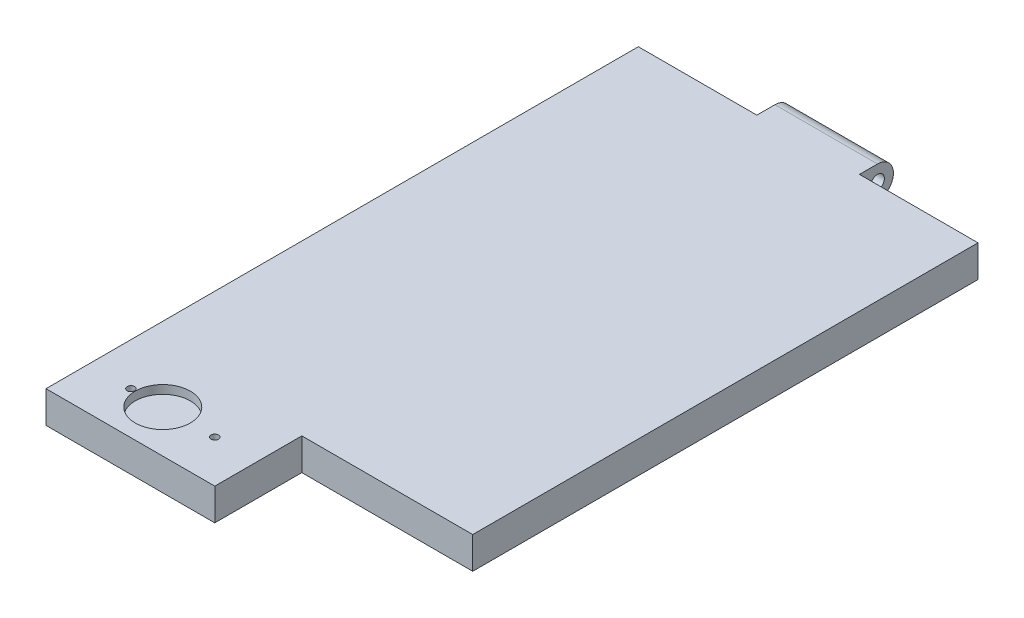
ISO-10303-21;
HEADER;
FILE_DESCRIPTION(('STEP AP214'),'2;1');
FILE_NAME('part.step','',(''),(''),'','','');
FILE_SCHEMA(('AUTOMOTIVE_DESIGN { 1 0 10303 214 1 1 1 1 }'));
ENDSEC;
DATA;
#1=APPLICATION_CONTEXT('core data for automotive mechanical design processes');
#2=APPLICATION_PROTOCOL_DEFINITION('international standard','automotive_design',2000,#1);
#3=PRODUCT_CONTEXT('',#1,'mechanical');
#4=PRODUCT('Part','Part','',(#3));
#5=PRODUCT_RELATED_PRODUCT_CATEGORY('part','',(#4));
#6=PRODUCT_DEFINITION_FORMATION('','',#4);
#7=PRODUCT_DEFINITION_CONTEXT('part definition',#1,'design');
#8=PRODUCT_DEFINITION('design','',#6,#7);
#9=PRODUCT_DEFINITION_SHAPE('','',#8);
#10=(LENGTH_UNIT() NAMED_UNIT(*) SI_UNIT(.MILLI.,.METRE.));
#11=(NAMED_UNIT(*) PLANE_ANGLE_UNIT() SI_UNIT($,.RADIAN.));
#12=(NAMED_UNIT(*) SI_UNIT($,.STERADIAN.) SOLID_ANGLE_UNIT());
#13=UNCERTAINTY_MEASURE_WITH_UNIT(LENGTH_MEASURE(1.E-05),#10,'distance_accuracy_value','');
#14=(GEOMETRIC_REPRESENTATION_CONTEXT(3) GLOBAL_UNCERTAINTY_ASSIGNED_CONTEXT((#13)) GLOBAL_UNIT_ASSIGNED_CONTEXT((#10,
#11,#12)) REPRESENTATION_CONTEXT('',''));
#15=CARTESIAN_POINT('',(0.,0.,0.));
#16=DIRECTION('',(0.,0.,1.));
#17=DIRECTION('',(1.,0.,0.));
#18=AXIS2_PLACEMENT_3D('',#15,#16,#17);
#19=CARTESIAN_POINT('',(0.,3.,56.0000000000242));
#20=DIRECTION('',(-1.,0.,0.));
#21=DIRECTION('',(0.,0.,1.));
#22=AXIS2_PLACEMENT_3D('',#19,#20,#21);
#23=PLANE('',#22);
#24=DIRECTION('',(0.,0.,-1.));
#25=VECTOR('',#24,1.);
#26=CARTESIAN_POINT('',(0.,3.,56.0000000000242));
#27=LINE('',#26,#25);
#28=CARTESIAN_POINT('',(0.,3.,56.0000000000242));
#29=VERTEX_POINT('',#28);
#30=CARTESIAN_POINT('',(0.,3.,0.2));
#31=VERTEX_POINT('',#30);
#32=EDGE_CURVE('E215',#29,#31,#27,.T.);
#33=ORIENTED_EDGE('',*,*,#32,.T.);
#34=DIRECTION('',(0.,1.,0.));
#35=VECTOR('',#34,1.);
#36=CARTESIAN_POINT('',(0.,0.,0.2));
#37=LINE('',#36,#35);
#38=CARTESIAN_POINT('',(0.,0.,0.2));
#39=VERTEX_POINT('',#38);
#40=EDGE_CURVE('E166',#39,#31,#37,.T.);
#41=ORIENTED_EDGE('',*,*,#40,.F.);
#42=DIRECTION('',(0.,0.,-1.));
#43=VECTOR('',#42,1.);
#44=CARTESIAN_POINT('',(0.,0.,56.0000000000242));
#45=LINE('',#44,#43);
#46=CARTESIAN_POINT('',(0.,0.,56.0000000000242));
#47=VERTEX_POINT('',#46);
#48=EDGE_CURVE('E214',#47,#39,#45,.T.);
#49=ORIENTED_EDGE('',*,*,#48,.F.);
#50=DIRECTION('',(0.,-1.,0.));
#51=VECTOR('',#50,1.);
#52=CARTESIAN_POINT('',(0.,3.,56.0000000000242));
#53=LINE('',#52,#51);
#54=EDGE_CURVE('E224',#29,#47,#53,.T.);
#55=ORIENTED_EDGE('',*,*,#54,.F.);
#56=EDGE_LOOP('',(#33,#41,#49,#55));
#57=FACE_BOUND('',#56,.T.);
#58=ADVANCED_FACE('F65',(#57),#23,.T.);
#59=CARTESIAN_POINT('',(32.,3.,56.0000000000242));
#60=DIRECTION('',(-1.,0.,0.));
#61=DIRECTION('',(0.,0.,1.));
#62=AXIS2_PLACEMENT_3D('',#59,#60,#61);
#63=PLANE('',#62);
#64=DIRECTION('',(0.,-1.,0.));
#65=VECTOR('',#64,1.);
#66=CARTESIAN_POINT('',(32.,0.,0.2));
#67=LINE('',#66,#65);
#68=CARTESIAN_POINT('',(32.,3.,0.2));
#69=VERTEX_POINT('',#68);
#70=CARTESIAN_POINT('',(32.,0.,0.2));
#71=VERTEX_POINT('',#70);
#72=EDGE_CURVE('E170',#69,#71,#67,.T.);
#73=ORIENTED_EDGE('',*,*,#72,.F.);
#74=DIRECTION('',(0.,0.,-1.));
#75=VECTOR('',#74,1.);
#76=CARTESIAN_POINT('',(32.,3.,56.0000000000242));
#77=LINE('',#76,#75);
#78=CARTESIAN_POINT('',(32.,3.,47.8000000000242));
#79=VERTEX_POINT('',#78);
#80=EDGE_CURVE('E217',#79,#69,#77,.T.);
#81=ORIENTED_EDGE('',*,*,#80,.F.);
#82=DIRECTION('',(0.,-1.,0.));
#83=VECTOR('',#82,1.);
#84=CARTESIAN_POINT('',(32.,3.,47.8000000000242));
#85=LINE('',#84,#83);
#86=CARTESIAN_POINT('',(32.,0.,47.8000000000242));
#87=VERTEX_POINT('',#86);
#88=EDGE_CURVE('E204',#79,#87,#85,.T.);
#89=ORIENTED_EDGE('',*,*,#88,.T.);
#90=DIRECTION('',(0.,0.,-1.));
#91=VECTOR('',#90,1.);
#92=CARTESIAN_POINT('',(32.,0.,56.0000000000242));
#93=LINE('',#92,#91);
#94=EDGE_CURVE('E227',#87,#71,#93,.T.);
#95=ORIENTED_EDGE('',*,*,#94,.T.);
#96=EDGE_LOOP('',(#73,#81,#89,#95));
#97=FACE_BOUND('',#96,.T.);
#98=ADVANCED_FACE('F261',(#97),#63,.F.);
#99=CARTESIAN_POINT('',(0.,3.,0.));
#100=DIRECTION('',(0.,-1.,0.));
#101=DIRECTION('',(0.,0.,-1.));
#102=AXIS2_PLACEMENT_3D('',#99,#100,#101);
#103=PLANE('',#102);
#104=CARTESIAN_POINT('',(11.9,3.,52.0000000000242));
#105=DIRECTION('',(0.,-1.,0.));
#106=DIRECTION('',(0.,0.,-1.));
#107=AXIS2_PLACEMENT_3D('',#104,#105,#106);
#108=CIRCLE('',#107,0.35);
#109=CARTESIAN_POINT('',(11.9,3.,51.6500000000242));
#110=VERTEX_POINT('',#109);
#111=EDGE_CURVE('E507',#110,#110,#108,.T.);
#112=ORIENTED_EDGE('',*,*,#111,.T.);
#113=EDGE_LOOP('',(#112));
#114=FACE_BOUND('',#113,.T.);
#115=CARTESIAN_POINT('',(4.,3.,52.0000000000242));
#116=DIRECTION('',(0.,-1.,0.));
#117=DIRECTION('',(0.,0.,-1.));
#118=AXIS2_PLACEMENT_3D('',#115,#116,#117);
#119=CIRCLE('',#118,0.350000000000002);
#120=CARTESIAN_POINT('',(4.,3.,51.6500000000242));
#121=VERTEX_POINT('',#120);
#122=EDGE_CURVE('E515',#121,#121,#119,.T.);
#123=ORIENTED_EDGE('',*,*,#122,.T.);
#124=EDGE_LOOP('',(#123));
#125=FACE_BOUND('',#124,.T.);
#126=CARTESIAN_POINT('',(7.00000000000002,3.,51.9999999999974));
#127=DIRECTION('',(0.,1.,0.));
#128=DIRECTION('',(0.,0.,1.));
#129=AXIS2_PLACEMENT_3D('',#126,#127,#128);
#130=CIRCLE('',#129,2.60000000000001);
#131=CARTESIAN_POINT('',(7.00000000000002,3.,54.5999999999974));
#132=VERTEX_POINT('',#131);
#133=EDGE_CURVE('E173',#132,#132,#130,.T.);
#134=ORIENTED_EDGE('',*,*,#133,.F.);
#135=EDGE_LOOP('',(#134));
#136=FACE_BOUND('',#135,.T.);
#137=DIRECTION('',(0.,0.,1.));
#138=VECTOR('',#137,1.);
#139=CARTESIAN_POINT('',(11.1666666666667,3.,-3.));
#140=LINE('',#139,#138);
#141=CARTESIAN_POINT('',(11.1666666666667,3.,-1.5));
#142=VERTEX_POINT('',#141);
#143=CARTESIAN_POINT('',(11.1666666666667,3.,0.2));
#144=VERTEX_POINT('',#143);
#145=EDGE_CURVE('E145',#142,#144,#140,.T.);
#146=ORIENTED_EDGE('',*,*,#145,.T.);
#147=DIRECTION('',(1.,0.,0.));
#148=VECTOR('',#147,1.);
#149=CARTESIAN_POINT('',(0.,3.,0.2));
#150=LINE('',#149,#148);
#151=EDGE_CURVE('E150',#31,#144,#150,.T.);
#152=ORIENTED_EDGE('',*,*,#151,.F.);
#153=ORIENTED_EDGE('',*,*,#32,.F.);
#154=DIRECTION('',(1.,0.,0.));
#155=VECTOR('',#154,1.);
#156=CARTESIAN_POINT('',(0.,3.,56.0000000000242));
#157=LINE('',#156,#155);
#158=CARTESIAN_POINT('',(15.9,3.,56.0000000000242));
#159=VERTEX_POINT('',#158);
#160=EDGE_CURVE('E221',#29,#159,#157,.T.);
#161=ORIENTED_EDGE('',*,*,#160,.T.);
#162=DIRECTION('',(0.,0.,-1.));
#163=VECTOR('',#162,1.);
#164=CARTESIAN_POINT('',(15.9,3.,0.));
#165=LINE('',#164,#163);
#166=CARTESIAN_POINT('',(15.9,3.,47.8000000000242));
#167=VERTEX_POINT('',#166);
#168=EDGE_CURVE('E200',#159,#167,#165,.T.);
#169=ORIENTED_EDGE('',*,*,#168,.T.);
#170=DIRECTION('',(1.,0.,0.));
#171=VECTOR('',#170,1.);
#172=CARTESIAN_POINT('',(0.,3.,47.8000000000242));
#173=LINE('',#172,#171);
#174=EDGE_CURVE('E197',#167,#79,#173,.T.);
#175=ORIENTED_EDGE('',*,*,#174,.T.);
#176=ORIENTED_EDGE('',*,*,#80,.T.);
#177=DIRECTION('',(1.,0.,0.));
#178=VECTOR('',#177,1.);
#179=CARTESIAN_POINT('',(0.,3.,0.2));
#180=LINE('',#179,#178);
#181=CARTESIAN_POINT('',(20.8333333333334,3.,0.2));
#182=VERTEX_POINT('',#181);
#183=EDGE_CURVE('E182',#182,#69,#180,.T.);
#184=ORIENTED_EDGE('',*,*,#183,.F.);
#185=DIRECTION('',(0.,0.,1.));
#186=VECTOR('',#185,1.);
#187=CARTESIAN_POINT('',(20.8333333333334,3.,-3.));
#188=LINE('',#187,#186);
#189=CARTESIAN_POINT('',(20.8333333333334,3.,-1.5));
#190=VERTEX_POINT('',#189);
#191=EDGE_CURVE('E194',#190,#182,#188,.T.);
#192=ORIENTED_EDGE('',*,*,#191,.F.);
#193=DIRECTION('',(1.,0.,0.));
#194=VECTOR('',#193,1.);
#195=CARTESIAN_POINT('',(11.1666666666667,3.,-1.5));
#196=LINE('',#195,#194);
#197=EDGE_CURVE('E154',#190,#142,#196,.F.);
#198=ORIENTED_EDGE('',*,*,#197,.T.);
#199=EDGE_LOOP('',(#146,#152,#153,#161,#169,#175,#176,#184,#192,#198));
#200=FACE_BOUND('',#199,.T.);
#201=ADVANCED_FACE('F147',(#114,#125,#136,#200),#103,.F.);
#202=CARTESIAN_POINT('',(0.,0.,0.));
#203=DIRECTION('',(0.,-1.,0.));
#204=DIRECTION('',(0.,0.,-1.));
#205=AXIS2_PLACEMENT_3D('',#202,#203,#204);
#206=PLANE('',#205);
#207=CARTESIAN_POINT('',(11.9,0.,52.0000000000242));
#208=DIRECTION('',(0.,-1.,0.));
#209=DIRECTION('',(0.,0.,-1.));
#210=AXIS2_PLACEMENT_3D('',#207,#208,#209);
#211=CIRCLE('',#210,0.35);
#212=CARTESIAN_POINT('',(11.9,0.,51.6500000000242));
#213=VERTEX_POINT('',#212);
#214=EDGE_CURVE('E510',#213,#213,#211,.T.);
#215=ORIENTED_EDGE('',*,*,#214,.F.);
#216=EDGE_LOOP('',(#215));
#217=FACE_BOUND('',#216,.T.);
#218=CARTESIAN_POINT('',(4.,0.,52.0000000000242));
#219=DIRECTION('',(0.,-1.,0.));
#220=DIRECTION('',(0.,0.,-1.));
#221=AXIS2_PLACEMENT_3D('',#218,#219,#220);
#222=CIRCLE('',#221,0.350000000000002);
#223=CARTESIAN_POINT('',(4.,0.,51.6500000000242));
#224=VERTEX_POINT('',#223);
#225=EDGE_CURVE('E511',#224,#224,#222,.T.);
#226=ORIENTED_EDGE('',*,*,#225,.F.);
#227=EDGE_LOOP('',(#226));
#228=FACE_BOUND('',#227,.T.);
#229=DIRECTION('',(-1.,0.,0.));
#230=VECTOR('',#229,1.);
#231=CARTESIAN_POINT('',(0.,0.,0.2));
#232=LINE('',#231,#230);
#233=CARTESIAN_POINT('',(11.1666666666667,0.,0.2));
#234=VERTEX_POINT('',#233);
#235=EDGE_CURVE('E162',#234,#39,#232,.T.);
#236=ORIENTED_EDGE('',*,*,#235,.F.);
#237=DIRECTION('',(0.,0.,1.));
#238=VECTOR('',#237,1.);
#239=CARTESIAN_POINT('',(11.1666666666667,0.,-3.));
#240=LINE('',#239,#238);
#241=CARTESIAN_POINT('',(11.1666666666667,0.,-1.5));
#242=VERTEX_POINT('',#241);
#243=EDGE_CURVE('E155',#242,#234,#240,.T.);
#244=ORIENTED_EDGE('',*,*,#243,.F.);
#245=DIRECTION('',(-1.,0.,0.));
#246=VECTOR('',#245,1.);
#247=CARTESIAN_POINT('',(0.,0.,-1.5));
#248=LINE('',#247,#246);
#249=CARTESIAN_POINT('',(20.8333333333334,0.,-1.5));
#250=VERTEX_POINT('',#249);
#251=EDGE_CURVE('E12',#242,#250,#248,.F.);
#252=ORIENTED_EDGE('',*,*,#251,.T.);
#253=DIRECTION('',(0.,0.,1.));
#254=VECTOR('',#253,1.);
#255=CARTESIAN_POINT('',(20.8333333333334,0.,-3.));
#256=LINE('',#255,#254);
#257=CARTESIAN_POINT('',(20.8333333333334,0.,0.2));
#258=VERTEX_POINT('',#257);
#259=EDGE_CURVE('E192',#250,#258,#256,.T.);
#260=ORIENTED_EDGE('',*,*,#259,.T.);
#261=DIRECTION('',(-1.,0.,0.));
#262=VECTOR('',#261,1.);
#263=CARTESIAN_POINT('',(0.,0.,0.2));
#264=LINE('',#263,#262);
#265=EDGE_CURVE('E167',#71,#258,#264,.T.);
#266=ORIENTED_EDGE('',*,*,#265,.F.);
#267=ORIENTED_EDGE('',*,*,#94,.F.);
#268=DIRECTION('',(1.,0.,0.));
#269=VECTOR('',#268,1.);
#270=CARTESIAN_POINT('',(0.,0.,47.8000000000242));
#271=LINE('',#270,#269);
#272=CARTESIAN_POINT('',(15.9,0.,47.8000000000242));
#273=VERTEX_POINT('',#272);
#274=EDGE_CURVE('E196',#273,#87,#271,.T.);
#275=ORIENTED_EDGE('',*,*,#274,.F.);
#276=DIRECTION('',(0.,0.,-1.));
#277=VECTOR('',#276,1.);
#278=CARTESIAN_POINT('',(15.9,0.,0.));
#279=LINE('',#278,#277);
#280=CARTESIAN_POINT('',(15.9,0.,56.0000000000242));
#281=VERTEX_POINT('',#280);
#282=EDGE_CURVE('E201',#281,#273,#279,.T.);
#283=ORIENTED_EDGE('',*,*,#282,.F.);
#284=DIRECTION('',(1.,0.,0.));
#285=VECTOR('',#284,1.);
#286=CARTESIAN_POINT('',(0.,0.,56.0000000000242));
#287=LINE('',#286,#285);
#288=EDGE_CURVE('E218',#47,#281,#287,.T.);
#289=ORIENTED_EDGE('',*,*,#288,.F.);
#290=ORIENTED_EDGE('',*,*,#48,.T.);
#291=EDGE_LOOP('',(#236,#244,#252,#260,#266,#267,#275,#283,#289,#290));
#292=FACE_BOUND('',#291,.T.);
#293=ADVANCED_FACE('F253',(#217,#228,#292),#206,.T.);
#294=CARTESIAN_POINT('',(0.,3.,56.0000000000242));
#295=DIRECTION('',(0.,0.,-1.));
#296=DIRECTION('',(-1.,0.,0.));
#297=AXIS2_PLACEMENT_3D('',#294,#295,#296);
#298=PLANE('',#297);
#299=ORIENTED_EDGE('',*,*,#288,.T.);
#300=DIRECTION('',(0.,-1.,0.));
#301=VECTOR('',#300,1.);
#302=CARTESIAN_POINT('',(15.9,3.,56.0000000000242));
#303=LINE('',#302,#301);
#304=EDGE_CURVE('E210',#159,#281,#303,.T.);
#305=ORIENTED_EDGE('',*,*,#304,.F.);
#306=ORIENTED_EDGE('',*,*,#160,.F.);
#307=ORIENTED_EDGE('',*,*,#54,.T.);
#308=EDGE_LOOP('',(#299,#305,#306,#307));
#309=FACE_BOUND('',#308,.T.);
#310=ADVANCED_FACE('F272',(#309),#298,.F.);
#311=CARTESIAN_POINT('',(0.,3.,47.8000000000242));
#312=DIRECTION('',(0.,0.,-1.));
#313=DIRECTION('',(-1.,0.,0.));
#314=AXIS2_PLACEMENT_3D('',#311,#312,#313);
#315=PLANE('',#314);
#316=ORIENTED_EDGE('',*,*,#274,.T.);
#317=ORIENTED_EDGE('',*,*,#88,.F.);
#318=ORIENTED_EDGE('',*,*,#174,.F.);
#319=DIRECTION('',(0.,-1.,0.));
#320=VECTOR('',#319,1.);
#321=CARTESIAN_POINT('',(15.9,3.,47.8000000000242));
#322=LINE('',#321,#320);
#323=EDGE_CURVE('E212',#167,#273,#322,.T.);
#324=ORIENTED_EDGE('',*,*,#323,.T.);
#325=EDGE_LOOP('',(#316,#317,#318,#324));
#326=FACE_BOUND('',#325,.T.);
#327=ADVANCED_FACE('F265',(#326),#315,.F.);
#328=CARTESIAN_POINT('',(15.9,3.,0.));
#329=DIRECTION('',(-1.,0.,0.));
#330=DIRECTION('',(0.,0.,1.));
#331=AXIS2_PLACEMENT_3D('',#328,#329,#330);
#332=PLANE('',#331);
#333=ORIENTED_EDGE('',*,*,#282,.T.);
#334=ORIENTED_EDGE('',*,*,#323,.F.);
#335=ORIENTED_EDGE('',*,*,#168,.F.);
#336=ORIENTED_EDGE('',*,*,#304,.T.);
#337=EDGE_LOOP('',(#333,#334,#335,#336));
#338=FACE_BOUND('',#337,.T.);
#339=ADVANCED_FACE('F269',(#338),#332,.F.);
#340=CARTESIAN_POINT('',(20.8333333333334,0.,-3.));
#341=DIRECTION('',(-1.,0.,0.));
#342=DIRECTION('',(0.,0.,1.));
#343=AXIS2_PLACEMENT_3D('',#340,#341,#342);
#344=PLANE('',#343);
#345=CARTESIAN_POINT('',(20.8333333333334,1.5,-1.5));
#346=DIRECTION('',(-1.,0.,0.));
#347=DIRECTION('',(0.,0.,1.));
#348=AXIS2_PLACEMENT_3D('',#345,#346,#347);
#349=CIRCLE('',#348,0.65);
#350=CARTESIAN_POINT('',(20.8333333333334,1.5,-0.85));
#351=VERTEX_POINT('',#350);
#352=EDGE_CURVE('E188',#351,#351,#349,.T.);
#353=ORIENTED_EDGE('',*,*,#352,.T.);
#354=EDGE_LOOP('',(#353));
#355=FACE_BOUND('',#354,.T.);
#356=CARTESIAN_POINT('',(20.8333333333334,1.5,-1.5));
#357=DIRECTION('',(-1.,0.,0.));
#358=DIRECTION('',(0.,0.,1.));
#359=AXIS2_PLACEMENT_3D('',#356,#357,#358);
#360=CIRCLE('',#359,1.5);
#361=CARTESIAN_POINT('',(20.8333333333334,1.5,-3.));
#362=VERTEX_POINT('',#361);
#363=EDGE_CURVE('E233',#250,#362,#360,.F.);
#364=ORIENTED_EDGE('',*,*,#363,.T.);
#365=CARTESIAN_POINT('',(20.8333333333334,1.5,-1.5));
#366=DIRECTION('',(-1.,0.,0.));
#367=DIRECTION('',(0.,0.,1.));
#368=AXIS2_PLACEMENT_3D('',#365,#366,#367);
#369=CIRCLE('',#368,1.5);
#370=EDGE_CURVE('E235',#362,#190,#369,.F.);
#371=ORIENTED_EDGE('',*,*,#370,.T.);
#372=ORIENTED_EDGE('',*,*,#191,.T.);
#373=DIRECTION('',(0.,-1.,0.));
#374=VECTOR('',#373,1.);
#375=CARTESIAN_POINT('',(20.8333333333334,0.,0.2));
#376=LINE('',#375,#374);
#377=EDGE_CURVE('E179',#182,#258,#376,.T.);
#378=ORIENTED_EDGE('',*,*,#377,.T.);
#379=ORIENTED_EDGE('',*,*,#259,.F.);
#380=EDGE_LOOP('',(#364,#371,#372,#378,#379));
#381=FACE_BOUND('',#380,.T.);
#382=ADVANCED_FACE('F241',(#355,#381),#344,.F.);
#383=CARTESIAN_POINT('',(11.1666666666667,0.,-3.));
#384=DIRECTION('',(-1.,0.,0.));
#385=DIRECTION('',(0.,0.,1.));
#386=AXIS2_PLACEMENT_3D('',#383,#384,#385);
#387=PLANE('',#386);
#388=CARTESIAN_POINT('',(11.1666666666667,1.5,-1.5));
#389=DIRECTION('',(-1.,0.,0.));
#390=DIRECTION('',(0.,0.,1.));
#391=AXIS2_PLACEMENT_3D('',#388,#389,#390);
#392=CIRCLE('',#391,0.65);
#393=CARTESIAN_POINT('',(11.1666666666667,1.5,-0.85));
#394=VERTEX_POINT('',#393);
#395=EDGE_CURVE('E178',#394,#394,#392,.T.);
#396=ORIENTED_EDGE('',*,*,#395,.F.);
#397=EDGE_LOOP('',(#396));
#398=FACE_BOUND('',#397,.T.);
#399=ORIENTED_EDGE('',*,*,#145,.F.);
#400=CARTESIAN_POINT('',(11.1666666666667,1.5,-1.5));
#401=DIRECTION('',(-1.,0.,0.));
#402=DIRECTION('',(0.,0.,1.));
#403=AXIS2_PLACEMENT_3D('',#400,#401,#402);
#404=CIRCLE('',#403,1.5);
#405=CARTESIAN_POINT('',(11.1666666666667,1.5,-3.));
#406=VERTEX_POINT('',#405);
#407=EDGE_CURVE('E74',#142,#406,#404,.T.);
#408=ORIENTED_EDGE('',*,*,#407,.T.);
#409=CARTESIAN_POINT('',(11.1666666666667,1.5,-1.5));
#410=DIRECTION('',(-1.,0.,0.));
#411=DIRECTION('',(0.,0.,1.));
#412=AXIS2_PLACEMENT_3D('',#409,#410,#411);
#413=CIRCLE('',#412,1.5);
#414=EDGE_CURVE('E81',#406,#242,#413,.T.);
#415=ORIENTED_EDGE('',*,*,#414,.T.);
#416=ORIENTED_EDGE('',*,*,#243,.T.);
#417=DIRECTION('',(0.,-1.,0.));
#418=VECTOR('',#417,1.);
#419=CARTESIAN_POINT('',(11.1666666666667,0.,0.2));
#420=LINE('',#419,#418);
#421=EDGE_CURVE('E158',#144,#234,#420,.T.);
#422=ORIENTED_EDGE('',*,*,#421,.F.);
#423=EDGE_LOOP('',(#399,#408,#415,#416,#422));
#424=FACE_BOUND('',#423,.T.);
#425=ADVANCED_FACE('F159',(#398,#424),#387,.T.);
#426=CARTESIAN_POINT('',(0.,1.5,-1.5));
#427=DIRECTION('',(-1.,0.,0.));
#428=DIRECTION('',(0.,0.,1.));
#429=AXIS2_PLACEMENT_3D('',#426,#427,#428);
#430=CYLINDRICAL_SURFACE('',#429,1.5);
#431=ORIENTED_EDGE('',*,*,#251,.F.);
#432=ORIENTED_EDGE('',*,*,#414,.F.);
#433=DIRECTION('',(-1.,0.,0.));
#434=VECTOR('',#433,1.);
#435=CARTESIAN_POINT('',(0.,1.5,-3.));
#436=LINE('',#435,#434);
#437=EDGE_CURVE('E69',#362,#406,#436,.T.);
#438=ORIENTED_EDGE('',*,*,#437,.F.);
#439=ORIENTED_EDGE('',*,*,#363,.F.);
#440=EDGE_LOOP('',(#431,#432,#438,#439));
#441=FACE_BOUND('',#440,.T.);
#442=ADVANCED_FACE('F67',(#441),#430,.T.);
#443=CARTESIAN_POINT('',(0.,1.5,-1.5));
#444=DIRECTION('',(-1.,0.,0.));
#445=DIRECTION('',(0.,0.,1.));
#446=AXIS2_PLACEMENT_3D('',#443,#444,#445);
#447=CYLINDRICAL_SURFACE('',#446,1.5);
#448=ORIENTED_EDGE('',*,*,#407,.F.);
#449=ORIENTED_EDGE('',*,*,#197,.F.);
#450=ORIENTED_EDGE('',*,*,#370,.F.);
#451=ORIENTED_EDGE('',*,*,#437,.T.);
#452=EDGE_LOOP('',(#448,#449,#450,#451));
#453=FACE_BOUND('',#452,.T.);
#454=ADVANCED_FACE('F249',(#453),#447,.T.);
#455=CARTESIAN_POINT('',(32.,1.5,-1.5));
#456=DIRECTION('',(-1.,0.,0.));
#457=DIRECTION('',(0.,0.,1.));
#458=AXIS2_PLACEMENT_3D('',#455,#456,#457);
#459=CYLINDRICAL_SURFACE('',#458,0.65);
#460=ORIENTED_EDGE('',*,*,#395,.T.);
#461=EDGE_LOOP('',(#460));
#462=FACE_BOUND('',#461,.T.);
#463=ORIENTED_EDGE('',*,*,#352,.F.);
#464=EDGE_LOOP('',(#463));
#465=FACE_BOUND('',#464,.T.);
#466=ADVANCED_FACE('F284',(#462,#465),#459,.F.);
#467=CARTESIAN_POINT('',(0.,0.,0.2));
#468=DIRECTION('',(0.,0.,-1.));
#469=DIRECTION('',(-1.,0.,0.));
#470=AXIS2_PLACEMENT_3D('',#467,#468,#469);
#471=PLANE('',#470);
#472=ORIENTED_EDGE('',*,*,#151,.T.);
#473=ORIENTED_EDGE('',*,*,#421,.T.);
#474=ORIENTED_EDGE('',*,*,#235,.T.);
#475=ORIENTED_EDGE('',*,*,#40,.T.);
#476=EDGE_LOOP('',(#472,#473,#474,#475));
#477=FACE_BOUND('',#476,.T.);
#478=ADVANCED_FACE('F164',(#477),#471,.T.);
#479=CARTESIAN_POINT('',(0.,0.,0.2));
#480=DIRECTION('',(0.,0.,-1.));
#481=DIRECTION('',(-1.,0.,0.));
#482=AXIS2_PLACEMENT_3D('',#479,#480,#481);
#483=PLANE('',#482);
#484=ORIENTED_EDGE('',*,*,#377,.F.);
#485=ORIENTED_EDGE('',*,*,#183,.T.);
#486=ORIENTED_EDGE('',*,*,#72,.T.);
#487=ORIENTED_EDGE('',*,*,#265,.T.);
#488=EDGE_LOOP('',(#484,#485,#486,#487));
#489=FACE_BOUND('',#488,.T.);
#490=ADVANCED_FACE('F256',(#489),#483,.T.);
#491=CARTESIAN_POINT('',(7.00000000000002,2.2,51.9999999999974));
#492=DIRECTION('',(0.,1.,0.));
#493=DIRECTION('',(0.,0.,1.));
#494=AXIS2_PLACEMENT_3D('',#491,#492,#493);
#495=CYLINDRICAL_SURFACE('',#494,2.60000000000001);
#496=CARTESIAN_POINT('',(7.00000000000002,2.2,51.9999999999974));
#497=DIRECTION('',(0.,1.,0.));
#498=DIRECTION('',(0.,0.,1.));
#499=AXIS2_PLACEMENT_3D('',#496,#497,#498);
#500=CIRCLE('',#499,2.60000000000001);
#501=CARTESIAN_POINT('',(7.00000000000002,2.2,54.5999999999974));
#502=VERTEX_POINT('',#501);
#503=EDGE_CURVE('E183',#502,#502,#500,.T.);
#504=ORIENTED_EDGE('',*,*,#503,.F.);
#505=EDGE_LOOP('',(#504));
#506=FACE_BOUND('',#505,.T.);
#507=ORIENTED_EDGE('',*,*,#133,.T.);
#508=EDGE_LOOP('',(#507));
#509=FACE_BOUND('',#508,.T.);
#510=ADVANCED_FACE('F359',(#506,#509),#495,.F.);
#511=CARTESIAN_POINT('',(7.00000000000002,2.2,51.9999999999974));
#512=DIRECTION('',(0.,1.,0.));
#513=DIRECTION('',(0.,0.,1.));
#514=AXIS2_PLACEMENT_3D('',#511,#512,#513);
#515=PLANE('',#514);
#516=ORIENTED_EDGE('',*,*,#503,.T.);
#517=EDGE_LOOP('',(#516));
#518=FACE_BOUND('',#517,.T.);
#519=ADVANCED_FACE('F367',(#518),#515,.T.);
#520=CARTESIAN_POINT('',(4.,3.,52.0000000000242));
#521=DIRECTION('',(0.,-1.,0.));
#522=DIRECTION('',(0.,0.,-1.));
#523=AXIS2_PLACEMENT_3D('',#520,#521,#522);
#524=CYLINDRICAL_SURFACE('',#523,0.350000000000002);
#525=ORIENTED_EDGE('',*,*,#122,.F.);
#526=EDGE_LOOP('',(#525));
#527=FACE_BOUND('',#526,.T.);
#528=ORIENTED_EDGE('',*,*,#225,.T.);
#529=EDGE_LOOP('',(#528));
#530=FACE_BOUND('',#529,.T.);
#531=ADVANCED_FACE('F378',(#527,#530),#524,.F.);
#532=CARTESIAN_POINT('',(11.9,3.,52.0000000000242));
#533=DIRECTION('',(0.,-1.,0.));
#534=DIRECTION('',(0.,0.,-1.));
#535=AXIS2_PLACEMENT_3D('',#532,#533,#534);
#536=CYLINDRICAL_SURFACE('',#535,0.35);
#537=ORIENTED_EDGE('',*,*,#111,.F.);
#538=EDGE_LOOP('',(#537));
#539=FACE_BOUND('',#538,.T.);
#540=ORIENTED_EDGE('',*,*,#214,.T.);
#541=EDGE_LOOP('',(#540));
#542=FACE_BOUND('',#541,.T.);
#543=ADVANCED_FACE('F400',(#539,#542),#536,.F.);
#544=CLOSED_SHELL('',(#58,#98,#201,#293,#310,#327,#339,#382,#425,#442,#454,#466,#478,#490,#510,
#519,#531,#543));
#545=MANIFOLD_SOLID_BREP('B2',#544);
#546=ADVANCED_BREP_SHAPE_REPRESENTATION('',(#18,#545),#14);
#547=SHAPE_DEFINITION_REPRESENTATION(#9,#546);
ENDSEC;
END-ISO-10303-21;
